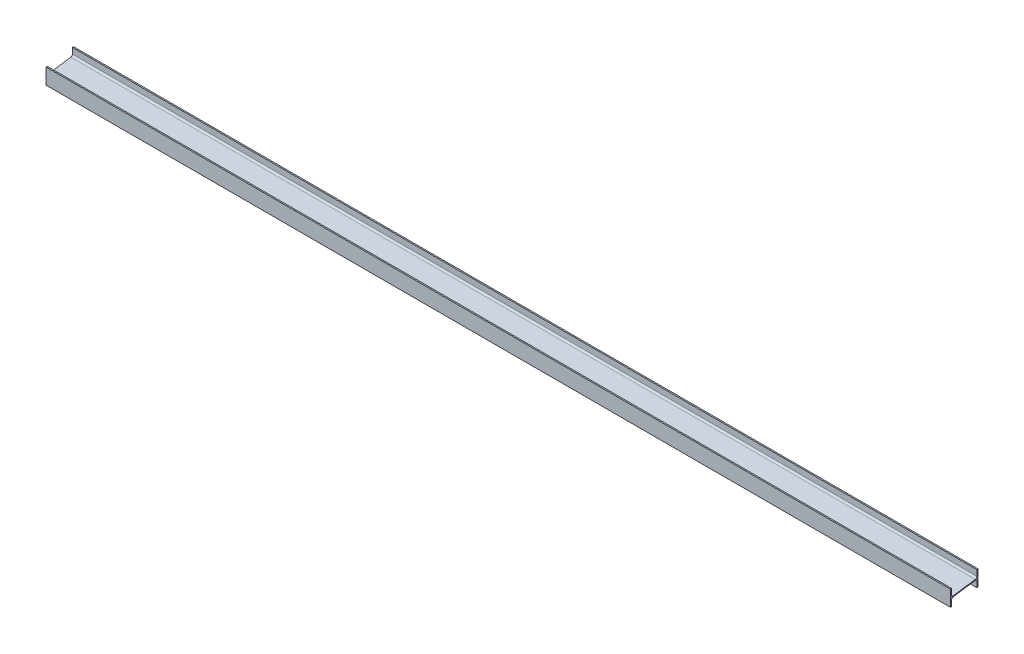
ISO-10303-21;
HEADER;
FILE_DESCRIPTION(('STEP AP214'),'2;1');
FILE_NAME('part.step','',(''),(''),'','','');
FILE_SCHEMA(('AUTOMOTIVE_DESIGN { 1 0 10303 214 1 1 1 1 }'));
ENDSEC;
DATA;
#1=APPLICATION_CONTEXT('core data for automotive mechanical design processes');
#2=APPLICATION_PROTOCOL_DEFINITION('international standard','automotive_design',2000,#1);
#3=PRODUCT_CONTEXT('',#1,'mechanical');
#4=PRODUCT('Part','Part','',(#3));
#5=PRODUCT_RELATED_PRODUCT_CATEGORY('part','',(#4));
#6=PRODUCT_DEFINITION_FORMATION('','',#4);
#7=PRODUCT_DEFINITION_CONTEXT('part definition',#1,'design');
#8=PRODUCT_DEFINITION('design','',#6,#7);
#9=PRODUCT_DEFINITION_SHAPE('','',#8);
#10=(LENGTH_UNIT() NAMED_UNIT(*) SI_UNIT(.MILLI.,.METRE.));
#11=(NAMED_UNIT(*) PLANE_ANGLE_UNIT() SI_UNIT($,.RADIAN.));
#12=(NAMED_UNIT(*) SI_UNIT($,.STERADIAN.) SOLID_ANGLE_UNIT());
#13=UNCERTAINTY_MEASURE_WITH_UNIT(LENGTH_MEASURE(1.E-05),#10,'distance_accuracy_value','');
#14=(GEOMETRIC_REPRESENTATION_CONTEXT(3) GLOBAL_UNCERTAINTY_ASSIGNED_CONTEXT((#13)) GLOBAL_UNIT_ASSIGNED_CONTEXT((#10,
#11,#12)) REPRESENTATION_CONTEXT('',''));
#15=CARTESIAN_POINT('',(0.,0.,0.));
#16=DIRECTION('',(0.,0.,1.));
#17=DIRECTION('',(1.,0.,0.));
#18=AXIS2_PLACEMENT_3D('',#15,#16,#17);
#19=CARTESIAN_POINT('',(5780.,13.7499999999998,80.9999999999995));
#20=DIRECTION('',(-1.,0.,0.));
#21=DIRECTION('',(0.,0.,1.));
#22=AXIS2_PLACEMENT_3D('',#19,#20,#21);
#23=CYLINDRICAL_SURFACE('',#22,11.);
#24=DIRECTION('',(-1.,0.,0.));
#25=VECTOR('',#24,1.);
#26=CARTESIAN_POINT('',(5780.,2.74999999999981,80.9999999999995));
#27=LINE('',#26,#25);
#28=CARTESIAN_POINT('',(5777.625,2.74999999999981,80.9999999999995));
#29=VERTEX_POINT('',#28);
#30=CARTESIAN_POINT('',(22.6249999999997,2.74999999999981,80.9999999999995));
#31=VERTEX_POINT('',#30);
#32=EDGE_CURVE('E240',#29,#31,#27,.T.);
#33=ORIENTED_EDGE('',*,*,#32,.T.);
#34=CARTESIAN_POINT('',(22.6249999999997,13.7499999999998,80.9999999999995));
#35=DIRECTION('',(0.992277876713668,0.,-0.124034734589208));
#36=DIRECTION('',(-0.124034734589208,0.,-0.992277876713668));
#37=AXIS2_PLACEMENT_3D('',#34,#35,#36);
#38=ELLIPSE('',#37,11.0856044039105,11.);
#39=CARTESIAN_POINT('',(24.,13.75,92.0000000000005));
#40=VERTEX_POINT('',#39);
#41=EDGE_CURVE('E364',#31,#40,#38,.F.);
#42=ORIENTED_EDGE('',*,*,#41,.T.);
#43=DIRECTION('',(-1.,0.,0.));
#44=VECTOR('',#43,1.);
#45=CARTESIAN_POINT('',(5780.,13.75,92.0000000000005));
#46=LINE('',#45,#44);
#47=CARTESIAN_POINT('',(5779.,13.75,92.0000000000005));
#48=VERTEX_POINT('',#47);
#49=EDGE_CURVE('E13',#48,#40,#46,.T.);
#50=ORIENTED_EDGE('',*,*,#49,.F.);
#51=CARTESIAN_POINT('',(5777.625,13.7499999999998,80.9999999999995));
#52=DIRECTION('',(-0.992277876713668,0.,0.12403473458921));
#53=DIRECTION('',(-0.12403473458921,0.,-0.992277876713668));
#54=AXIS2_PLACEMENT_3D('',#51,#52,#53);
#55=ELLIPSE('',#54,11.0856044039105,11.);
#56=EDGE_CURVE('E304',#48,#29,#55,.F.);
#57=ORIENTED_EDGE('',*,*,#56,.T.);
#58=EDGE_LOOP('',(#33,#42,#50,#57));
#59=FACE_BOUND('',#58,.T.);
#60=ADVANCED_FACE('F87',(#59),#23,.F.);
#61=CARTESIAN_POINT('',(5780.,50.,92.0000000000005));
#62=DIRECTION('',(0.,0.,1.));
#63=DIRECTION('',(0.,-1.,0.));
#64=AXIS2_PLACEMENT_3D('',#61,#62,#63);
#65=PLANE('',#64);
#66=ORIENTED_EDGE('',*,*,#49,.T.);
#67=DIRECTION('',(0.,1.,0.));
#68=VECTOR('',#67,1.);
#69=CARTESIAN_POINT('',(24.,49.9999999999997,92.0000000000005));
#70=LINE('',#69,#68);
#71=CARTESIAN_POINT('',(24.,50.,92.0000000000005));
#72=VERTEX_POINT('',#71);
#73=EDGE_CURVE('E366',#40,#72,#70,.T.);
#74=ORIENTED_EDGE('',*,*,#73,.T.);
#75=DIRECTION('',(-1.,0.,0.));
#76=VECTOR('',#75,1.);
#77=CARTESIAN_POINT('',(5780.,50.,92.0000000000005));
#78=LINE('',#77,#76);
#79=CARTESIAN_POINT('',(5779.,50.,92.0000000000005));
#80=VERTEX_POINT('',#79);
#81=EDGE_CURVE('E96',#80,#72,#78,.T.);
#82=ORIENTED_EDGE('',*,*,#81,.F.);
#83=DIRECTION('',(0.,-1.,0.));
#84=VECTOR('',#83,1.);
#85=CARTESIAN_POINT('',(5779.,50.,92.0000000000005));
#86=LINE('',#85,#84);
#87=EDGE_CURVE('E306',#80,#48,#86,.T.);
#88=ORIENTED_EDGE('',*,*,#87,.T.);
#89=EDGE_LOOP('',(#66,#74,#82,#88));
#90=FACE_BOUND('',#89,.T.);
#91=ADVANCED_FACE('F387',(#90),#65,.F.);
#92=CARTESIAN_POINT('',(5780.,50.,99.9999999999996));
#93=DIRECTION('',(0.,-1.,0.));
#94=DIRECTION('',(0.,0.,-1.));
#95=AXIS2_PLACEMENT_3D('',#92,#93,#94);
#96=PLANE('',#95);
#97=ORIENTED_EDGE('',*,*,#81,.T.);
#98=DIRECTION('',(-0.124034734589208,0.,-0.992277876713668));
#99=VECTOR('',#98,1.);
#100=CARTESIAN_POINT('',(0.,50.,-99.9999999999996));
#101=LINE('',#100,#99);
#102=CARTESIAN_POINT('',(25.0000000000004,50.,100.000000000001));
#103=VERTEX_POINT('',#102);
#104=EDGE_CURVE('E199',#103,#72,#101,.T.);
#105=ORIENTED_EDGE('',*,*,#104,.F.);
#106=DIRECTION('',(-1.,0.,0.));
#107=VECTOR('',#106,1.);
#108=CARTESIAN_POINT('',(5780.,50.,99.9999999999996));
#109=LINE('',#108,#107);
#110=CARTESIAN_POINT('',(5780.,50.,99.9999999999996));
#111=VERTEX_POINT('',#110);
#112=EDGE_CURVE('E212',#111,#103,#109,.T.);
#113=ORIENTED_EDGE('',*,*,#112,.F.);
#114=DIRECTION('',(0.12403473458921,0.,0.992277876713668));
#115=VECTOR('',#114,1.);
#116=CARTESIAN_POINT('',(5755.,50.,-99.9999999999996));
#117=LINE('',#116,#115);
#118=EDGE_CURVE('E103',#80,#111,#117,.T.);
#119=ORIENTED_EDGE('',*,*,#118,.F.);
#120=EDGE_LOOP('',(#97,#105,#113,#119));
#121=FACE_BOUND('',#120,.T.);
#122=ADVANCED_FACE('F211',(#121),#96,.F.);
#123=CARTESIAN_POINT('',(5780.,50.,99.9999999999996));
#124=DIRECTION('',(0.,0.,-1.));
#125=DIRECTION('',(0.,1.,0.));
#126=AXIS2_PLACEMENT_3D('',#123,#124,#125);
#127=PLANE('',#126);
#128=ORIENTED_EDGE('',*,*,#112,.T.);
#129=DIRECTION('',(0.,1.,0.));
#130=VECTOR('',#129,1.);
#131=CARTESIAN_POINT('',(25.0000000000004,-50.000012,100.000000000001));
#132=LINE('',#131,#130);
#133=CARTESIAN_POINT('',(25.0000000000004,-49.9999999999999,100.000000000001));
#134=VERTEX_POINT('',#133);
#135=EDGE_CURVE('E196',#134,#103,#132,.T.);
#136=ORIENTED_EDGE('',*,*,#135,.F.);
#137=DIRECTION('',(-1.,0.,0.));
#138=VECTOR('',#137,1.);
#139=CARTESIAN_POINT('',(5780.,-49.9999999999999,99.9999999999996));
#140=LINE('',#139,#138);
#141=CARTESIAN_POINT('',(5780.,-49.9999999999999,99.9999999999996));
#142=VERTEX_POINT('',#141);
#143=EDGE_CURVE('E219',#142,#134,#140,.T.);
#144=ORIENTED_EDGE('',*,*,#143,.F.);
#145=DIRECTION('',(0.,-1.,0.));
#146=VECTOR('',#145,1.);
#147=CARTESIAN_POINT('',(5780.,50.,99.9999999999996));
#148=LINE('',#147,#146);
#149=EDGE_CURVE('E218',#111,#142,#148,.T.);
#150=ORIENTED_EDGE('',*,*,#149,.F.);
#151=EDGE_LOOP('',(#128,#136,#144,#150));
#152=FACE_BOUND('',#151,.T.);
#153=ADVANCED_FACE('F217',(#152),#127,.F.);
#154=CARTESIAN_POINT('',(5780.,-49.9999999999999,99.9999999999996));
#155=DIRECTION('',(0.,1.,0.));
#156=DIRECTION('',(0.,0.,1.));
#157=AXIS2_PLACEMENT_3D('',#154,#155,#156);
#158=PLANE('',#157);
#159=ORIENTED_EDGE('',*,*,#143,.T.);
#160=DIRECTION('',(-0.124034734589208,0.,-0.992277876713668));
#161=VECTOR('',#160,1.);
#162=CARTESIAN_POINT('',(113.538461538461,-50.,808.307692307691));
#163=LINE('',#162,#161);
#164=CARTESIAN_POINT('',(24.,-49.9999999999999,92.0000000000005));
#165=VERTEX_POINT('',#164);
#166=EDGE_CURVE('E202',#134,#165,#163,.T.);
#167=ORIENTED_EDGE('',*,*,#166,.T.);
#168=DIRECTION('',(-1.,0.,0.));
#169=VECTOR('',#168,1.);
#170=CARTESIAN_POINT('',(5780.,-49.9999999999999,92.0000000000005));
#171=LINE('',#170,#169);
#172=CARTESIAN_POINT('',(5779.,-49.9999999999999,92.0000000000005));
#173=VERTEX_POINT('',#172);
#174=EDGE_CURVE('E222',#173,#165,#171,.T.);
#175=ORIENTED_EDGE('',*,*,#174,.F.);
#176=DIRECTION('',(0.12403473458921,0.,0.992277876713668));
#177=VECTOR('',#176,1.);
#178=CARTESIAN_POINT('',(5780.,-49.9999999999999,99.9999999999996));
#179=LINE('',#178,#177);
#180=EDGE_CURVE('E229',#173,#142,#179,.T.);
#181=ORIENTED_EDGE('',*,*,#180,.T.);
#182=EDGE_LOOP('',(#159,#167,#175,#181));
#183=FACE_BOUND('',#182,.T.);
#184=ADVANCED_FACE('F289',(#183),#158,.F.);
#185=CARTESIAN_POINT('',(5780.,-13.75,92.0000000000005));
#186=DIRECTION('',(0.,0.,1.));
#187=DIRECTION('',(1.,0.,0.));
#188=AXIS2_PLACEMENT_3D('',#185,#186,#187);
#189=PLANE('',#188);
#190=ORIENTED_EDGE('',*,*,#174,.T.);
#191=DIRECTION('',(0.,1.,0.));
#192=VECTOR('',#191,1.);
#193=CARTESIAN_POINT('',(24.,-13.75,92.0000000000005));
#194=LINE('',#193,#192);
#195=CARTESIAN_POINT('',(24.,-13.75,92.0000000000005));
#196=VERTEX_POINT('',#195);
#197=EDGE_CURVE('E286',#165,#196,#194,.T.);
#198=ORIENTED_EDGE('',*,*,#197,.T.);
#199=DIRECTION('',(-1.,0.,0.));
#200=VECTOR('',#199,1.);
#201=CARTESIAN_POINT('',(5780.,-13.75,92.0000000000005));
#202=LINE('',#201,#200);
#203=CARTESIAN_POINT('',(5779.,-13.75,92.0000000000005));
#204=VERTEX_POINT('',#203);
#205=EDGE_CURVE('E274',#204,#196,#202,.T.);
#206=ORIENTED_EDGE('',*,*,#205,.F.);
#207=DIRECTION('',(0.,-1.,0.));
#208=VECTOR('',#207,1.);
#209=CARTESIAN_POINT('',(5779.,-13.75,92.0000000000005));
#210=LINE('',#209,#208);
#211=EDGE_CURVE('E287',#204,#173,#210,.T.);
#212=ORIENTED_EDGE('',*,*,#211,.T.);
#213=EDGE_LOOP('',(#190,#198,#206,#212));
#214=FACE_BOUND('',#213,.T.);
#215=ADVANCED_FACE('F285',(#214),#189,.F.);
#216=CARTESIAN_POINT('',(5780.,-13.7500000000003,80.9999999999995));
#217=DIRECTION('',(-1.,0.,0.));
#218=DIRECTION('',(0.,0.,1.));
#219=AXIS2_PLACEMENT_3D('',#216,#217,#218);
#220=CYLINDRICAL_SURFACE('',#219,11.);
#221=ORIENTED_EDGE('',*,*,#205,.T.);
#222=CARTESIAN_POINT('',(22.6249999999997,-13.7500000000003,80.9999999999995));
#223=DIRECTION('',(0.992277876713668,0.,-0.124034734589208));
#224=DIRECTION('',(-0.124034734589208,0.,-0.992277876713668));
#225=AXIS2_PLACEMENT_3D('',#222,#223,#224);
#226=ELLIPSE('',#225,11.0856044039105,11.);
#227=CARTESIAN_POINT('',(22.6249999999997,-2.75000000000036,80.9999999999995));
#228=VERTEX_POINT('',#227);
#229=EDGE_CURVE('E295',#196,#228,#226,.F.);
#230=ORIENTED_EDGE('',*,*,#229,.T.);
#231=DIRECTION('',(-1.,0.,0.));
#232=VECTOR('',#231,1.);
#233=CARTESIAN_POINT('',(5780.,-2.75000000000036,80.9999999999995));
#234=LINE('',#233,#232);
#235=CARTESIAN_POINT('',(5777.625,-2.75000000000036,80.9999999999995));
#236=VERTEX_POINT('',#235);
#237=EDGE_CURVE('E272',#236,#228,#234,.T.);
#238=ORIENTED_EDGE('',*,*,#237,.F.);
#239=CARTESIAN_POINT('',(5777.625,-13.7500000000003,80.9999999999995));
#240=DIRECTION('',(-0.992277876713668,0.,0.12403473458921));
#241=DIRECTION('',(-0.12403473458921,0.,-0.992277876713668));
#242=AXIS2_PLACEMENT_3D('',#239,#240,#241);
#243=ELLIPSE('',#242,11.0856044039105,11.);
#244=EDGE_CURVE('E321',#236,#204,#243,.F.);
#245=ORIENTED_EDGE('',*,*,#244,.T.);
#246=EDGE_LOOP('',(#221,#230,#238,#245));
#247=FACE_BOUND('',#246,.T.);
#248=ADVANCED_FACE('F324',(#247),#220,.F.);
#249=CARTESIAN_POINT('',(5780.,-2.75000000000036,80.9999999999995));
#250=DIRECTION('',(0.,1.,0.));
#251=DIRECTION('',(0.,0.,1.));
#252=AXIS2_PLACEMENT_3D('',#249,#250,#251);
#253=PLANE('',#252);
#254=ORIENTED_EDGE('',*,*,#237,.T.);
#255=DIRECTION('',(-0.124034734589208,0.,-0.992277876713668));
#256=VECTOR('',#255,1.);
#257=CARTESIAN_POINT('',(111.199999999999,-2.75000000000003,789.6));
#258=LINE('',#257,#256);
#259=CARTESIAN_POINT('',(2.37499999999979,-2.75000000000003,-80.9999999999995));
#260=VERTEX_POINT('',#259);
#261=EDGE_CURVE('E330',#228,#260,#258,.T.);
#262=ORIENTED_EDGE('',*,*,#261,.T.);
#263=DIRECTION('',(-1.,0.,0.));
#264=VECTOR('',#263,1.);
#265=CARTESIAN_POINT('',(5780.,-2.75000000000003,-80.9999999999995));
#266=LINE('',#265,#264);
#267=CARTESIAN_POINT('',(5757.375,-2.75000000000003,-80.9999999999995));
#268=VERTEX_POINT('',#267);
#269=EDGE_CURVE('E269',#268,#260,#266,.T.);
#270=ORIENTED_EDGE('',*,*,#269,.F.);
#271=DIRECTION('',(0.12403473458921,0.,0.992277876713668));
#272=VECTOR('',#271,1.);
#273=CARTESIAN_POINT('',(5777.66153846154,-2.75000000000036,81.2923076923084));
#274=LINE('',#273,#272);
#275=EDGE_CURVE('E318',#268,#236,#274,.T.);
#276=ORIENTED_EDGE('',*,*,#275,.T.);
#277=EDGE_LOOP('',(#254,#262,#270,#276));
#278=FACE_BOUND('',#277,.T.);
#279=ADVANCED_FACE('F328',(#278),#253,.F.);
#280=CARTESIAN_POINT('',(5780.,-13.75,-80.9999999999995));
#281=DIRECTION('',(-1.,0.,0.));
#282=DIRECTION('',(0.,0.,1.));
#283=AXIS2_PLACEMENT_3D('',#280,#281,#282);
#284=CYLINDRICAL_SURFACE('',#283,11.);
#285=ORIENTED_EDGE('',*,*,#269,.T.);
#286=CARTESIAN_POINT('',(2.37499999999979,-13.75,-80.9999999999995));
#287=DIRECTION('',(0.992277876713668,0.,-0.124034734589208));
#288=DIRECTION('',(-0.124034734589208,0.,-0.992277876713668));
#289=AXIS2_PLACEMENT_3D('',#286,#287,#288);
#290=ELLIPSE('',#289,11.0856044039105,11.);
#291=CARTESIAN_POINT('',(1.00000000000033,-13.75,-92.0000000000005));
#292=VERTEX_POINT('',#291);
#293=EDGE_CURVE('E335',#260,#292,#290,.F.);
#294=ORIENTED_EDGE('',*,*,#293,.T.);
#295=DIRECTION('',(-1.,0.,0.));
#296=VECTOR('',#295,1.);
#297=CARTESIAN_POINT('',(5780.,-13.75,-92.0000000000005));
#298=LINE('',#297,#296);
#299=CARTESIAN_POINT('',(5756.,-13.75,-92.0000000000005));
#300=VERTEX_POINT('',#299);
#301=EDGE_CURVE('E266',#300,#292,#298,.T.);
#302=ORIENTED_EDGE('',*,*,#301,.F.);
#303=CARTESIAN_POINT('',(5757.375,-13.75,-80.9999999999995));
#304=DIRECTION('',(-0.992277876713668,0.,0.12403473458921));
#305=DIRECTION('',(-0.12403473458921,0.,-0.992277876713668));
#306=AXIS2_PLACEMENT_3D('',#303,#304,#305);
#307=ELLIPSE('',#306,11.0856044039105,11.);
#308=EDGE_CURVE('E315',#300,#268,#307,.F.);
#309=ORIENTED_EDGE('',*,*,#308,.T.);
#310=EDGE_LOOP('',(#285,#294,#302,#309));
#311=FACE_BOUND('',#310,.T.);
#312=ADVANCED_FACE('F333',(#311),#284,.F.);
#313=CARTESIAN_POINT('',(5780.,-13.75,-92.0000000000005));
#314=DIRECTION('',(0.,0.,-1.));
#315=DIRECTION('',(-1.,0.,0.));
#316=AXIS2_PLACEMENT_3D('',#313,#314,#315);
#317=PLANE('',#316);
#318=ORIENTED_EDGE('',*,*,#301,.T.);
#319=DIRECTION('',(0.,-1.,0.));
#320=VECTOR('',#319,1.);
#321=CARTESIAN_POINT('',(1.00000000000033,-13.75,-92.0000000000005));
#322=LINE('',#321,#320);
#323=CARTESIAN_POINT('',(1.00000000000033,-49.9999999999999,-92.0000000000005));
#324=VERTEX_POINT('',#323);
#325=EDGE_CURVE('E340',#292,#324,#322,.T.);
#326=ORIENTED_EDGE('',*,*,#325,.T.);
#327=DIRECTION('',(-1.,0.,0.));
#328=VECTOR('',#327,1.);
#329=CARTESIAN_POINT('',(5780.,-49.9999999999999,-92.0000000000005));
#330=LINE('',#329,#328);
#331=CARTESIAN_POINT('',(5756.,-49.9999999999999,-92.0000000000005));
#332=VERTEX_POINT('',#331);
#333=EDGE_CURVE('E235',#332,#324,#330,.T.);
#334=ORIENTED_EDGE('',*,*,#333,.F.);
#335=DIRECTION('',(0.,1.,0.));
#336=VECTOR('',#335,1.);
#337=CARTESIAN_POINT('',(5756.,-13.75,-92.0000000000005));
#338=LINE('',#337,#336);
#339=EDGE_CURVE('E312',#332,#300,#338,.T.);
#340=ORIENTED_EDGE('',*,*,#339,.T.);
#341=EDGE_LOOP('',(#318,#326,#334,#340));
#342=FACE_BOUND('',#341,.T.);
#343=ADVANCED_FACE('F338',(#342),#317,.F.);
#344=CARTESIAN_POINT('',(5780.,-49.9999999999999,-92.0000000000005));
#345=DIRECTION('',(0.,1.,0.));
#346=DIRECTION('',(0.,0.,1.));
#347=AXIS2_PLACEMENT_3D('',#344,#345,#346);
#348=PLANE('',#347);
#349=ORIENTED_EDGE('',*,*,#333,.T.);
#350=DIRECTION('',(-0.124034734589208,0.,-0.992277876713668));
#351=VECTOR('',#350,1.);
#352=CARTESIAN_POINT('',(89.9076923076922,-50.0000000000002,619.261538461538));
#353=LINE('',#352,#351);
#354=CARTESIAN_POINT('',(0.,-49.9999999999999,-99.9999999999996));
#355=VERTEX_POINT('',#354);
#356=EDGE_CURVE('E345',#324,#355,#353,.T.);
#357=ORIENTED_EDGE('',*,*,#356,.T.);
#358=DIRECTION('',(-1.,0.,0.));
#359=VECTOR('',#358,1.);
#360=CARTESIAN_POINT('',(5780.,-49.9999999999999,-99.9999999999996));
#361=LINE('',#360,#359);
#362=CARTESIAN_POINT('',(5755.,-49.9999999999999,-99.9999999999996));
#363=VERTEX_POINT('',#362);
#364=EDGE_CURVE('E232',#363,#355,#361,.T.);
#365=ORIENTED_EDGE('',*,*,#364,.F.);
#366=DIRECTION('',(0.12403473458921,0.,0.992277876713668));
#367=VECTOR('',#366,1.);
#368=CARTESIAN_POINT('',(5756.36923076923,-50.,-89.0461538461533));
#369=LINE('',#368,#367);
#370=EDGE_CURVE('E309',#363,#332,#369,.T.);
#371=ORIENTED_EDGE('',*,*,#370,.T.);
#372=EDGE_LOOP('',(#349,#357,#365,#371));
#373=FACE_BOUND('',#372,.T.);
#374=ADVANCED_FACE('F343',(#373),#348,.F.);
#375=CARTESIAN_POINT('',(5780.,50.,-99.9999999999996));
#376=DIRECTION('',(0.,0.,1.));
#377=DIRECTION('',(0.,-1.,0.));
#378=AXIS2_PLACEMENT_3D('',#375,#376,#377);
#379=PLANE('',#378);
#380=DIRECTION('',(-1.,0.,0.));
#381=VECTOR('',#380,1.);
#382=CARTESIAN_POINT('',(5780.,50.,-99.9999999999996));
#383=LINE('',#382,#381);
#384=CARTESIAN_POINT('',(5755.,50.,-99.9999999999996));
#385=VERTEX_POINT('',#384);
#386=CARTESIAN_POINT('',(0.,50.,-99.9999999999996));
#387=VERTEX_POINT('',#386);
#388=EDGE_CURVE('E236',#385,#387,#383,.T.);
#389=ORIENTED_EDGE('',*,*,#388,.F.);
#390=DIRECTION('',(0.,1.,0.));
#391=VECTOR('',#390,1.);
#392=CARTESIAN_POINT('',(5755.,-50.0000119999999,-99.9999999999996));
#393=LINE('',#392,#391);
#394=EDGE_CURVE('E347',#363,#385,#393,.T.);
#395=ORIENTED_EDGE('',*,*,#394,.F.);
#396=ORIENTED_EDGE('',*,*,#364,.T.);
#397=DIRECTION('',(0.,1.,0.));
#398=VECTOR('',#397,1.);
#399=CARTESIAN_POINT('',(0.,50.,-99.9999999999996));
#400=LINE('',#399,#398);
#401=EDGE_CURVE('E226',#355,#387,#400,.T.);
#402=ORIENTED_EDGE('',*,*,#401,.T.);
#403=EDGE_LOOP('',(#389,#395,#396,#402));
#404=FACE_BOUND('',#403,.T.);
#405=ADVANCED_FACE('F351',(#404),#379,.F.);
#406=CARTESIAN_POINT('',(5780.,50.,-92.0000000000005));
#407=DIRECTION('',(0.,-1.,0.));
#408=DIRECTION('',(0.,0.,-1.));
#409=AXIS2_PLACEMENT_3D('',#406,#407,#408);
#410=PLANE('',#409);
#411=ORIENTED_EDGE('',*,*,#388,.T.);
#412=CARTESIAN_POINT('',(1.00000000000033,50.,-92.0000000000005));
#413=VERTEX_POINT('',#412);
#414=EDGE_CURVE('E215',#413,#387,#101,.T.);
#415=ORIENTED_EDGE('',*,*,#414,.F.);
#416=DIRECTION('',(-1.,0.,0.));
#417=VECTOR('',#416,1.);
#418=CARTESIAN_POINT('',(5780.,50.,-92.0000000000005));
#419=LINE('',#418,#417);
#420=CARTESIAN_POINT('',(5756.,50.,-92.0000000000005));
#421=VERTEX_POINT('',#420);
#422=EDGE_CURVE('E259',#421,#413,#419,.T.);
#423=ORIENTED_EDGE('',*,*,#422,.F.);
#424=EDGE_CURVE('E352',#385,#421,#117,.T.);
#425=ORIENTED_EDGE('',*,*,#424,.F.);
#426=EDGE_LOOP('',(#411,#415,#423,#425));
#427=FACE_BOUND('',#426,.T.);
#428=ADVANCED_FACE('F376',(#427),#410,.F.);
#429=CARTESIAN_POINT('',(5780.,50.,-92.0000000000005));
#430=DIRECTION('',(0.,0.,-1.));
#431=DIRECTION('',(0.,1.,0.));
#432=AXIS2_PLACEMENT_3D('',#429,#430,#431);
#433=PLANE('',#432);
#434=ORIENTED_EDGE('',*,*,#422,.T.);
#435=DIRECTION('',(0.,-1.,0.));
#436=VECTOR('',#435,1.);
#437=CARTESIAN_POINT('',(1.00000000000033,50.0000000000003,-92.0000000000005));
#438=LINE('',#437,#436);
#439=CARTESIAN_POINT('',(0.999999999999446,13.75,-92.0000000000005));
#440=VERTEX_POINT('',#439);
#441=EDGE_CURVE('E361',#413,#440,#438,.T.);
#442=ORIENTED_EDGE('',*,*,#441,.T.);
#443=DIRECTION('',(-1.,0.,0.));
#444=VECTOR('',#443,1.);
#445=CARTESIAN_POINT('',(5780.,13.75,-92.0000000000005));
#446=LINE('',#445,#444);
#447=CARTESIAN_POINT('',(5756.,13.75,-92.0000000000005));
#448=VERTEX_POINT('',#447);
#449=EDGE_CURVE('E251',#448,#440,#446,.T.);
#450=ORIENTED_EDGE('',*,*,#449,.F.);
#451=DIRECTION('',(0.,1.,0.));
#452=VECTOR('',#451,1.);
#453=CARTESIAN_POINT('',(5756.,50.,-92.0000000000005));
#454=LINE('',#453,#452);
#455=EDGE_CURVE('E301',#448,#421,#454,.T.);
#456=ORIENTED_EDGE('',*,*,#455,.T.);
#457=EDGE_LOOP('',(#434,#442,#450,#456));
#458=FACE_BOUND('',#457,.T.);
#459=ADVANCED_FACE('F379',(#458),#433,.F.);
#460=CARTESIAN_POINT('',(5780.,13.75,-80.9999999999995));
#461=DIRECTION('',(-1.,0.,0.));
#462=DIRECTION('',(0.,0.,1.));
#463=AXIS2_PLACEMENT_3D('',#460,#461,#462);
#464=CYLINDRICAL_SURFACE('',#463,11.);
#465=ORIENTED_EDGE('',*,*,#449,.T.);
#466=CARTESIAN_POINT('',(2.37499999999979,13.75,-80.9999999999995));
#467=DIRECTION('',(0.992277876713668,0.,-0.124034734589208));
#468=DIRECTION('',(-0.124034734589208,0.,-0.992277876713668));
#469=AXIS2_PLACEMENT_3D('',#466,#467,#468);
#470=ELLIPSE('',#469,11.0856044039105,11.);
#471=CARTESIAN_POINT('',(2.37499999999891,2.75000000000003,-80.9999999999995));
#472=VERTEX_POINT('',#471);
#473=EDGE_CURVE('E358',#440,#472,#470,.F.);
#474=ORIENTED_EDGE('',*,*,#473,.T.);
#475=DIRECTION('',(-1.,0.,0.));
#476=VECTOR('',#475,1.);
#477=CARTESIAN_POINT('',(5780.,2.75000000000003,-80.9999999999995));
#478=LINE('',#477,#476);
#479=CARTESIAN_POINT('',(5757.375,2.75000000000003,-80.9999999999995));
#480=VERTEX_POINT('',#479);
#481=EDGE_CURVE('E244',#480,#472,#478,.T.);
#482=ORIENTED_EDGE('',*,*,#481,.F.);
#483=CARTESIAN_POINT('',(5757.375,13.75,-80.9999999999995));
#484=DIRECTION('',(-0.992277876713668,0.,0.12403473458921));
#485=DIRECTION('',(-0.12403473458921,0.,-0.992277876713668));
#486=AXIS2_PLACEMENT_3D('',#483,#484,#485);
#487=ELLIPSE('',#486,11.0856044039105,11.);
#488=EDGE_CURVE('E293',#480,#448,#487,.F.);
#489=ORIENTED_EDGE('',*,*,#488,.T.);
#490=EDGE_LOOP('',(#465,#474,#482,#489));
#491=FACE_BOUND('',#490,.T.);
#492=ADVANCED_FACE('F381',(#491),#464,.F.);
#493=CARTESIAN_POINT('',(5780.,2.74999999999981,80.9999999999995));
#494=DIRECTION('',(0.,-1.,0.));
#495=DIRECTION('',(0.,0.,-1.));
#496=AXIS2_PLACEMENT_3D('',#493,#494,#495);
#497=PLANE('',#496);
#498=ORIENTED_EDGE('',*,*,#481,.T.);
#499=DIRECTION('',(0.124034734589208,0.,0.992277876713668));
#500=VECTOR('',#499,1.);
#501=CARTESIAN_POINT('',(111.199999999999,2.74999999999992,789.6));
#502=LINE('',#501,#500);
#503=EDGE_CURVE('E207',#472,#31,#502,.T.);
#504=ORIENTED_EDGE('',*,*,#503,.T.);
#505=ORIENTED_EDGE('',*,*,#32,.F.);
#506=DIRECTION('',(-0.12403473458921,0.,-0.992277876713668));
#507=VECTOR('',#506,1.);
#508=CARTESIAN_POINT('',(5777.66153846154,2.74999999999981,81.2923076923084));
#509=LINE('',#508,#507);
#510=EDGE_CURVE('E290',#29,#480,#509,.T.);
#511=ORIENTED_EDGE('',*,*,#510,.T.);
#512=EDGE_LOOP('',(#498,#504,#505,#511));
#513=FACE_BOUND('',#512,.T.);
#514=ADVANCED_FACE('F384',(#513),#497,.F.);
#515=CARTESIAN_POINT('',(0.,-50.0000119999999,-99.9999999999996));
#516=DIRECTION('',(0.992277876713668,0.,-0.124034734589208));
#517=DIRECTION('',(-0.124034734589208,0.,-0.992277876713668));
#518=AXIS2_PLACEMENT_3D('',#515,#516,#517);
#519=PLANE('',#518);
#520=ORIENTED_EDGE('',*,*,#135,.T.);
#521=ORIENTED_EDGE('',*,*,#104,.T.);
#522=ORIENTED_EDGE('',*,*,#73,.F.);
#523=ORIENTED_EDGE('',*,*,#41,.F.);
#524=ORIENTED_EDGE('',*,*,#503,.F.);
#525=ORIENTED_EDGE('',*,*,#473,.F.);
#526=ORIENTED_EDGE('',*,*,#441,.F.);
#527=ORIENTED_EDGE('',*,*,#414,.T.);
#528=ORIENTED_EDGE('',*,*,#401,.F.);
#529=ORIENTED_EDGE('',*,*,#356,.F.);
#530=ORIENTED_EDGE('',*,*,#325,.F.);
#531=ORIENTED_EDGE('',*,*,#293,.F.);
#532=ORIENTED_EDGE('',*,*,#261,.F.);
#533=ORIENTED_EDGE('',*,*,#229,.F.);
#534=ORIENTED_EDGE('',*,*,#197,.F.);
#535=ORIENTED_EDGE('',*,*,#166,.F.);
#536=EDGE_LOOP('',(#520,#521,#522,#523,#524,#525,#526,#527,#528,#529,#530,#531,#532,#533,#534,#535));
#537=FACE_BOUND('',#536,.T.);
#538=ADVANCED_FACE('F198',(#537),#519,.F.);
#539=CARTESIAN_POINT('',(5755.,-50.0000119999999,-99.9999999999996));
#540=DIRECTION('',(-0.992277876713668,0.,0.12403473458921));
#541=DIRECTION('',(0.12403473458921,0.,0.992277876713668));
#542=AXIS2_PLACEMENT_3D('',#539,#540,#541);
#543=PLANE('',#542);
#544=ORIENTED_EDGE('',*,*,#211,.F.);
#545=ORIENTED_EDGE('',*,*,#244,.F.);
#546=ORIENTED_EDGE('',*,*,#275,.F.);
#547=ORIENTED_EDGE('',*,*,#308,.F.);
#548=ORIENTED_EDGE('',*,*,#339,.F.);
#549=ORIENTED_EDGE('',*,*,#370,.F.);
#550=ORIENTED_EDGE('',*,*,#394,.T.);
#551=ORIENTED_EDGE('',*,*,#424,.T.);
#552=ORIENTED_EDGE('',*,*,#455,.F.);
#553=ORIENTED_EDGE('',*,*,#488,.F.);
#554=ORIENTED_EDGE('',*,*,#510,.F.);
#555=ORIENTED_EDGE('',*,*,#56,.F.);
#556=ORIENTED_EDGE('',*,*,#87,.F.);
#557=ORIENTED_EDGE('',*,*,#118,.T.);
#558=ORIENTED_EDGE('',*,*,#149,.T.);
#559=ORIENTED_EDGE('',*,*,#180,.F.);
#560=EDGE_LOOP('',(#544,#545,#546,#547,#548,#549,#550,#551,#552,#553,#554,#555,#556,#557,#558,#559));
#561=FACE_BOUND('',#560,.T.);
#562=ADVANCED_FACE('F325',(#561),#543,.F.);
#563=CLOSED_SHELL('',(#60,#91,#122,#153,#184,#215,#248,#279,#312,#343,#374,#405,#428,#459,#492,
#514,#538,#562));
#564=MANIFOLD_SOLID_BREP('B2',#563);
#565=ADVANCED_BREP_SHAPE_REPRESENTATION('',(#18,#564),#14);
#566=SHAPE_DEFINITION_REPRESENTATION(#9,#565);
ENDSEC;
END-ISO-10303-21;
